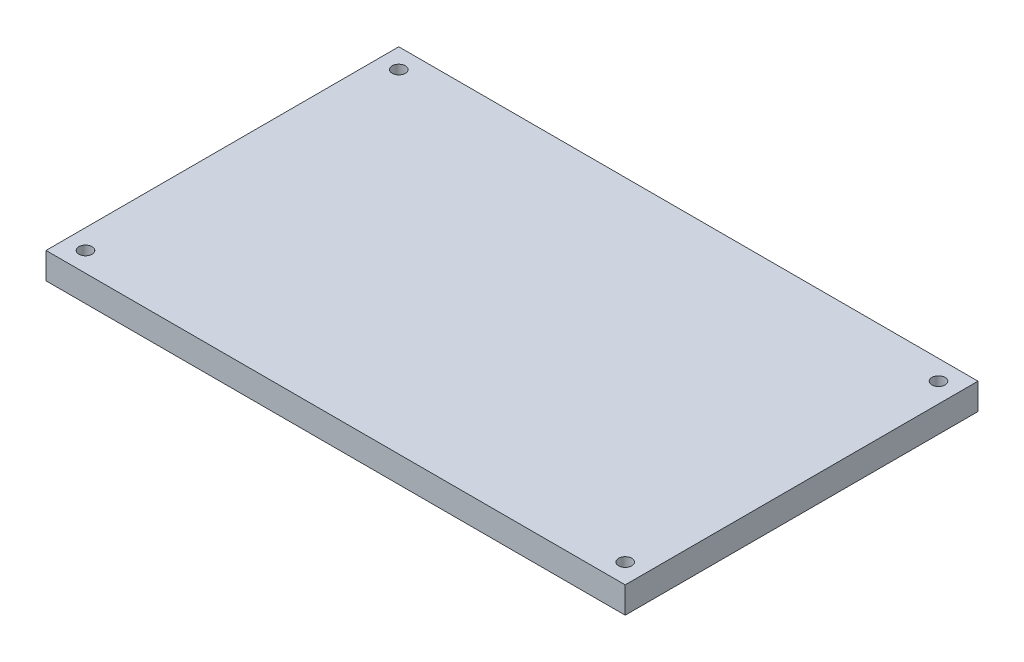
ISO-10303-21;
HEADER;
FILE_DESCRIPTION(('STEP AP214'),'2;1');
FILE_NAME('part.step','',(''),(''),'','','');
FILE_SCHEMA(('AUTOMOTIVE_DESIGN { 1 0 10303 214 1 1 1 1 }'));
ENDSEC;
DATA;
#1=APPLICATION_CONTEXT('core data for automotive mechanical design processes');
#2=APPLICATION_PROTOCOL_DEFINITION('international standard','automotive_design',2000,#1);
#3=PRODUCT_CONTEXT('',#1,'mechanical');
#4=PRODUCT('Part','Part','',(#3));
#5=PRODUCT_RELATED_PRODUCT_CATEGORY('part','',(#4));
#6=PRODUCT_DEFINITION_FORMATION('','',#4);
#7=PRODUCT_DEFINITION_CONTEXT('part definition',#1,'design');
#8=PRODUCT_DEFINITION('design','',#6,#7);
#9=PRODUCT_DEFINITION_SHAPE('','',#8);
#10=(LENGTH_UNIT() NAMED_UNIT(*) SI_UNIT(.MILLI.,.METRE.));
#11=(NAMED_UNIT(*) PLANE_ANGLE_UNIT() SI_UNIT($,.RADIAN.));
#12=(NAMED_UNIT(*) SI_UNIT($,.STERADIAN.) SOLID_ANGLE_UNIT());
#13=UNCERTAINTY_MEASURE_WITH_UNIT(LENGTH_MEASURE(1.E-05),#10,'distance_accuracy_value','');
#14=(GEOMETRIC_REPRESENTATION_CONTEXT(3) GLOBAL_UNCERTAINTY_ASSIGNED_CONTEXT((#13)) GLOBAL_UNIT_ASSIGNED_CONTEXT((#10,
#11,#12)) REPRESENTATION_CONTEXT('',''));
#15=CARTESIAN_POINT('',(0.,0.,0.));
#16=DIRECTION('',(0.,0.,1.));
#17=DIRECTION('',(1.,0.,0.));
#18=AXIS2_PLACEMENT_3D('',#15,#16,#17);
#19=CARTESIAN_POINT('',(0.,6.35,0.));
#20=DIRECTION('',(0.,1.,0.));
#21=DIRECTION('',(0.,0.,1.));
#22=AXIS2_PLACEMENT_3D('',#19,#20,#21);
#23=PLANE('',#22);
#24=CARTESIAN_POINT('',(134.9375,6.35,-4.7625));
#25=DIRECTION('',(0.,1.,0.));
#26=DIRECTION('',(0.,0.,1.));
#27=AXIS2_PLACEMENT_3D('',#24,#25,#26);
#28=CIRCLE('',#27,1.58750000000004);
#29=CARTESIAN_POINT('',(134.9375,6.35,-3.17499999999996));
#30=VERTEX_POINT('',#29);
#31=EDGE_CURVE('E121',#30,#30,#28,.T.);
#32=ORIENTED_EDGE('',*,*,#31,.F.);
#33=EDGE_LOOP('',(#32));
#34=FACE_BOUND('',#33,.T.);
#35=CARTESIAN_POINT('',(4.76250000000003,6.35,-80.3275));
#36=DIRECTION('',(0.,1.,0.));
#37=DIRECTION('',(0.,0.,1.));
#38=AXIS2_PLACEMENT_3D('',#35,#36,#37);
#39=CIRCLE('',#38,1.58749999999999);
#40=CARTESIAN_POINT('',(4.76250000000003,6.35,-78.74));
#41=VERTEX_POINT('',#40);
#42=EDGE_CURVE('E100',#41,#41,#39,.T.);
#43=ORIENTED_EDGE('',*,*,#42,.F.);
#44=EDGE_LOOP('',(#43));
#45=FACE_BOUND('',#44,.T.);
#46=DIRECTION('',(0.,0.,1.));
#47=VECTOR('',#46,1.);
#48=CARTESIAN_POINT('',(0.,6.35,-85.09));
#49=LINE('',#48,#47);
#50=CARTESIAN_POINT('',(0.,6.35,-85.09));
#51=VERTEX_POINT('',#50);
#52=CARTESIAN_POINT('',(0.,6.35,0.));
#53=VERTEX_POINT('',#52);
#54=EDGE_CURVE('E85',#51,#53,#49,.T.);
#55=ORIENTED_EDGE('',*,*,#54,.T.);
#56=DIRECTION('',(1.,0.,0.));
#57=VECTOR('',#56,1.);
#58=CARTESIAN_POINT('',(0.,6.35,0.));
#59=LINE('',#58,#57);
#60=CARTESIAN_POINT('',(139.7,6.35,0.));
#61=VERTEX_POINT('',#60);
#62=EDGE_CURVE('E80',#53,#61,#59,.T.);
#63=ORIENTED_EDGE('',*,*,#62,.T.);
#64=DIRECTION('',(0.,0.,-1.));
#65=VECTOR('',#64,1.);
#66=CARTESIAN_POINT('',(139.7,6.35,-85.09));
#67=LINE('',#66,#65);
#68=CARTESIAN_POINT('',(139.7,6.35,-85.09));
#69=VERTEX_POINT('',#68);
#70=EDGE_CURVE('E83',#61,#69,#67,.T.);
#71=ORIENTED_EDGE('',*,*,#70,.T.);
#72=DIRECTION('',(-1.,0.,0.));
#73=VECTOR('',#72,1.);
#74=CARTESIAN_POINT('',(0.,6.35,-85.09));
#75=LINE('',#74,#73);
#76=EDGE_CURVE('E50',#69,#51,#75,.T.);
#77=ORIENTED_EDGE('',*,*,#76,.T.);
#78=EDGE_LOOP('',(#55,#63,#71,#77));
#79=FACE_BOUND('',#78,.T.);
#80=CARTESIAN_POINT('',(4.76250000000003,6.35,-4.7625));
#81=DIRECTION('',(0.,1.,0.));
#82=DIRECTION('',(0.,0.,1.));
#83=AXIS2_PLACEMENT_3D('',#80,#81,#82);
#84=CIRCLE('',#83,1.58749999999998);
#85=CARTESIAN_POINT('',(4.76250000000003,6.35,-3.17500000000002));
#86=VERTEX_POINT('',#85);
#87=EDGE_CURVE('E115',#86,#86,#84,.T.);
#88=ORIENTED_EDGE('',*,*,#87,.F.);
#89=EDGE_LOOP('',(#88));
#90=FACE_BOUND('',#89,.T.);
#91=CARTESIAN_POINT('',(134.9375,6.35,-80.3275));
#92=DIRECTION('',(0.,1.,0.));
#93=DIRECTION('',(0.,0.,1.));
#94=AXIS2_PLACEMENT_3D('',#91,#92,#93);
#95=CIRCLE('',#94,1.58750000000004);
#96=CARTESIAN_POINT('',(134.9375,6.35,-78.74));
#97=VERTEX_POINT('',#96);
#98=EDGE_CURVE('E127',#97,#97,#95,.T.);
#99=ORIENTED_EDGE('',*,*,#98,.F.);
#100=EDGE_LOOP('',(#99));
#101=FACE_BOUND('',#100,.T.);
#102=ADVANCED_FACE('F33',(#34,#45,#79,#90,#101),#23,.T.);
#103=CARTESIAN_POINT('',(0.,0.,0.));
#104=DIRECTION('',(0.,1.,0.));
#105=DIRECTION('',(0.,0.,1.));
#106=AXIS2_PLACEMENT_3D('',#103,#104,#105);
#107=PLANE('',#106);
#108=CARTESIAN_POINT('',(134.9375,0.,-4.7625));
#109=DIRECTION('',(0.,1.,0.));
#110=DIRECTION('',(0.,0.,1.));
#111=AXIS2_PLACEMENT_3D('',#108,#109,#110);
#112=CIRCLE('',#111,1.58750000000004);
#113=CARTESIAN_POINT('',(134.9375,0.,-3.17499999999996));
#114=VERTEX_POINT('',#113);
#115=EDGE_CURVE('E124',#114,#114,#112,.T.);
#116=ORIENTED_EDGE('',*,*,#115,.T.);
#117=EDGE_LOOP('',(#116));
#118=FACE_BOUND('',#117,.T.);
#119=CARTESIAN_POINT('',(4.76250000000003,0.,-80.3275));
#120=DIRECTION('',(0.,1.,0.));
#121=DIRECTION('',(0.,0.,1.));
#122=AXIS2_PLACEMENT_3D('',#119,#120,#121);
#123=CIRCLE('',#122,1.58749999999999);
#124=CARTESIAN_POINT('',(4.76250000000003,0.,-78.74));
#125=VERTEX_POINT('',#124);
#126=EDGE_CURVE('E112',#125,#125,#123,.T.);
#127=ORIENTED_EDGE('',*,*,#126,.T.);
#128=EDGE_LOOP('',(#127));
#129=FACE_BOUND('',#128,.T.);
#130=DIRECTION('',(0.,0.,1.));
#131=VECTOR('',#130,1.);
#132=CARTESIAN_POINT('',(0.,0.,-85.09));
#133=LINE('',#132,#131);
#134=CARTESIAN_POINT('',(0.,0.,-85.09));
#135=VERTEX_POINT('',#134);
#136=CARTESIAN_POINT('',(0.,0.,0.));
#137=VERTEX_POINT('',#136);
#138=EDGE_CURVE('E97',#135,#137,#133,.T.);
#139=ORIENTED_EDGE('',*,*,#138,.F.);
#140=DIRECTION('',(-1.,0.,0.));
#141=VECTOR('',#140,1.);
#142=CARTESIAN_POINT('',(0.,0.,-85.09));
#143=LINE('',#142,#141);
#144=CARTESIAN_POINT('',(139.7,0.,-85.09));
#145=VERTEX_POINT('',#144);
#146=EDGE_CURVE('E73',#145,#135,#143,.T.);
#147=ORIENTED_EDGE('',*,*,#146,.F.);
#148=DIRECTION('',(0.,0.,-1.));
#149=VECTOR('',#148,1.);
#150=CARTESIAN_POINT('',(139.7,0.,-85.09));
#151=LINE('',#150,#149);
#152=CARTESIAN_POINT('',(139.7,0.,0.));
#153=VERTEX_POINT('',#152);
#154=EDGE_CURVE('E67',#153,#145,#151,.T.);
#155=ORIENTED_EDGE('',*,*,#154,.F.);
#156=DIRECTION('',(1.,0.,0.));
#157=VECTOR('',#156,1.);
#158=CARTESIAN_POINT('',(0.,0.,0.));
#159=LINE('',#158,#157);
#160=EDGE_CURVE('E89',#137,#153,#159,.T.);
#161=ORIENTED_EDGE('',*,*,#160,.F.);
#162=EDGE_LOOP('',(#139,#147,#155,#161));
#163=FACE_BOUND('',#162,.T.);
#164=CARTESIAN_POINT('',(4.76250000000003,0.,-4.7625));
#165=DIRECTION('',(0.,1.,0.));
#166=DIRECTION('',(0.,0.,1.));
#167=AXIS2_PLACEMENT_3D('',#164,#165,#166);
#168=CIRCLE('',#167,1.58749999999998);
#169=CARTESIAN_POINT('',(4.76250000000003,0.,-3.17500000000002));
#170=VERTEX_POINT('',#169);
#171=EDGE_CURVE('E118',#170,#170,#168,.T.);
#172=ORIENTED_EDGE('',*,*,#171,.T.);
#173=EDGE_LOOP('',(#172));
#174=FACE_BOUND('',#173,.T.);
#175=CARTESIAN_POINT('',(134.9375,0.,-80.3275));
#176=DIRECTION('',(0.,1.,0.));
#177=DIRECTION('',(0.,0.,1.));
#178=AXIS2_PLACEMENT_3D('',#175,#176,#177);
#179=CIRCLE('',#178,1.58750000000004);
#180=CARTESIAN_POINT('',(134.9375,0.,-78.74));
#181=VERTEX_POINT('',#180);
#182=EDGE_CURVE('E130',#181,#181,#179,.T.);
#183=ORIENTED_EDGE('',*,*,#182,.T.);
#184=EDGE_LOOP('',(#183));
#185=FACE_BOUND('',#184,.T.);
#186=ADVANCED_FACE('F108',(#118,#129,#163,#174,#185),#107,.F.);
#187=CARTESIAN_POINT('',(0.,6.35,-85.09));
#188=DIRECTION('',(1.,0.,0.));
#189=DIRECTION('',(0.,0.,-1.));
#190=AXIS2_PLACEMENT_3D('',#187,#188,#189);
#191=PLANE('',#190);
#192=ORIENTED_EDGE('',*,*,#138,.T.);
#193=DIRECTION('',(0.,-1.,0.));
#194=VECTOR('',#193,1.);
#195=CARTESIAN_POINT('',(0.,6.35,0.));
#196=LINE('',#195,#194);
#197=EDGE_CURVE('E11',#53,#137,#196,.T.);
#198=ORIENTED_EDGE('',*,*,#197,.F.);
#199=ORIENTED_EDGE('',*,*,#54,.F.);
#200=DIRECTION('',(0.,-1.,0.));
#201=VECTOR('',#200,1.);
#202=CARTESIAN_POINT('',(0.,6.35,-85.09));
#203=LINE('',#202,#201);
#204=EDGE_CURVE('E93',#51,#135,#203,.T.);
#205=ORIENTED_EDGE('',*,*,#204,.T.);
#206=EDGE_LOOP('',(#192,#198,#199,#205));
#207=FACE_BOUND('',#206,.T.);
#208=ADVANCED_FACE('F35',(#207),#191,.F.);
#209=CARTESIAN_POINT('',(0.,6.35,0.));
#210=DIRECTION('',(0.,0.,-1.));
#211=DIRECTION('',(-1.,0.,0.));
#212=AXIS2_PLACEMENT_3D('',#209,#210,#211);
#213=PLANE('',#212);
#214=ORIENTED_EDGE('',*,*,#160,.T.);
#215=DIRECTION('',(0.,-1.,0.));
#216=VECTOR('',#215,1.);
#217=CARTESIAN_POINT('',(139.7,6.35,0.));
#218=LINE('',#217,#216);
#219=EDGE_CURVE('E42',#61,#153,#218,.T.);
#220=ORIENTED_EDGE('',*,*,#219,.F.);
#221=ORIENTED_EDGE('',*,*,#62,.F.);
#222=ORIENTED_EDGE('',*,*,#197,.T.);
#223=EDGE_LOOP('',(#214,#220,#221,#222));
#224=FACE_BOUND('',#223,.T.);
#225=ADVANCED_FACE('F88',(#224),#213,.F.);
#226=CARTESIAN_POINT('',(139.7,6.35,-85.09));
#227=DIRECTION('',(-1.,0.,0.));
#228=DIRECTION('',(0.,0.,1.));
#229=AXIS2_PLACEMENT_3D('',#226,#227,#228);
#230=PLANE('',#229);
#231=ORIENTED_EDGE('',*,*,#154,.T.);
#232=DIRECTION('',(0.,-1.,0.));
#233=VECTOR('',#232,1.);
#234=CARTESIAN_POINT('',(139.7,6.35,-85.09));
#235=LINE('',#234,#233);
#236=EDGE_CURVE('E90',#69,#145,#235,.T.);
#237=ORIENTED_EDGE('',*,*,#236,.F.);
#238=ORIENTED_EDGE('',*,*,#70,.F.);
#239=ORIENTED_EDGE('',*,*,#219,.T.);
#240=EDGE_LOOP('',(#231,#237,#238,#239));
#241=FACE_BOUND('',#240,.T.);
#242=ADVANCED_FACE('F91',(#241),#230,.F.);
#243=CARTESIAN_POINT('',(0.,6.35,-85.09));
#244=DIRECTION('',(0.,0.,1.));
#245=DIRECTION('',(1.,0.,0.));
#246=AXIS2_PLACEMENT_3D('',#243,#244,#245);
#247=PLANE('',#246);
#248=ORIENTED_EDGE('',*,*,#146,.T.);
#249=ORIENTED_EDGE('',*,*,#204,.F.);
#250=ORIENTED_EDGE('',*,*,#76,.F.);
#251=ORIENTED_EDGE('',*,*,#236,.T.);
#252=EDGE_LOOP('',(#248,#249,#250,#251));
#253=FACE_BOUND('',#252,.T.);
#254=ADVANCED_FACE('F105',(#253),#247,.F.);
#255=CARTESIAN_POINT('',(4.76250000000003,6.35,-80.3275));
#256=DIRECTION('',(0.,-1.,0.));
#257=DIRECTION('',(0.,0.,-1.));
#258=AXIS2_PLACEMENT_3D('',#255,#256,#257);
#259=CYLINDRICAL_SURFACE('',#258,1.58749999999999);
#260=ORIENTED_EDGE('',*,*,#42,.T.);
#261=EDGE_LOOP('',(#260));
#262=FACE_BOUND('',#261,.T.);
#263=ORIENTED_EDGE('',*,*,#126,.F.);
#264=EDGE_LOOP('',(#263));
#265=FACE_BOUND('',#264,.T.);
#266=ADVANCED_FACE('F150',(#262,#265),#259,.F.);
#267=CARTESIAN_POINT('',(4.76250000000003,6.35,-4.7625));
#268=DIRECTION('',(0.,-1.,0.));
#269=DIRECTION('',(0.,0.,-1.));
#270=AXIS2_PLACEMENT_3D('',#267,#268,#269);
#271=CYLINDRICAL_SURFACE('',#270,1.58749999999998);
#272=ORIENTED_EDGE('',*,*,#87,.T.);
#273=EDGE_LOOP('',(#272));
#274=FACE_BOUND('',#273,.T.);
#275=ORIENTED_EDGE('',*,*,#171,.F.);
#276=EDGE_LOOP('',(#275));
#277=FACE_BOUND('',#276,.T.);
#278=ADVANCED_FACE('F196',(#274,#277),#271,.F.);
#279=CARTESIAN_POINT('',(134.9375,6.35,-4.7625));
#280=DIRECTION('',(0.,-1.,0.));
#281=DIRECTION('',(0.,0.,-1.));
#282=AXIS2_PLACEMENT_3D('',#279,#280,#281);
#283=CYLINDRICAL_SURFACE('',#282,1.58750000000004);
#284=ORIENTED_EDGE('',*,*,#31,.T.);
#285=EDGE_LOOP('',(#284));
#286=FACE_BOUND('',#285,.T.);
#287=ORIENTED_EDGE('',*,*,#115,.F.);
#288=EDGE_LOOP('',(#287));
#289=FACE_BOUND('',#288,.T.);
#290=ADVANCED_FACE('F204',(#286,#289),#283,.F.);
#291=CARTESIAN_POINT('',(134.9375,6.35,-80.3275));
#292=DIRECTION('',(0.,-1.,0.));
#293=DIRECTION('',(0.,0.,-1.));
#294=AXIS2_PLACEMENT_3D('',#291,#292,#293);
#295=CYLINDRICAL_SURFACE('',#294,1.58750000000004);
#296=ORIENTED_EDGE('',*,*,#98,.T.);
#297=EDGE_LOOP('',(#296));
#298=FACE_BOUND('',#297,.T.);
#299=ORIENTED_EDGE('',*,*,#182,.F.);
#300=EDGE_LOOP('',(#299));
#301=FACE_BOUND('',#300,.T.);
#302=ADVANCED_FACE('F136',(#298,#301),#295,.F.);
#303=CLOSED_SHELL('',(#102,#186,#208,#225,#242,#254,#266,#278,#290,#302));
#304=MANIFOLD_SOLID_BREP('B2',#303);
#305=ADVANCED_BREP_SHAPE_REPRESENTATION('',(#18,#304),#14);
#306=SHAPE_DEFINITION_REPRESENTATION(#9,#305);
ENDSEC;
END-ISO-10303-21;
